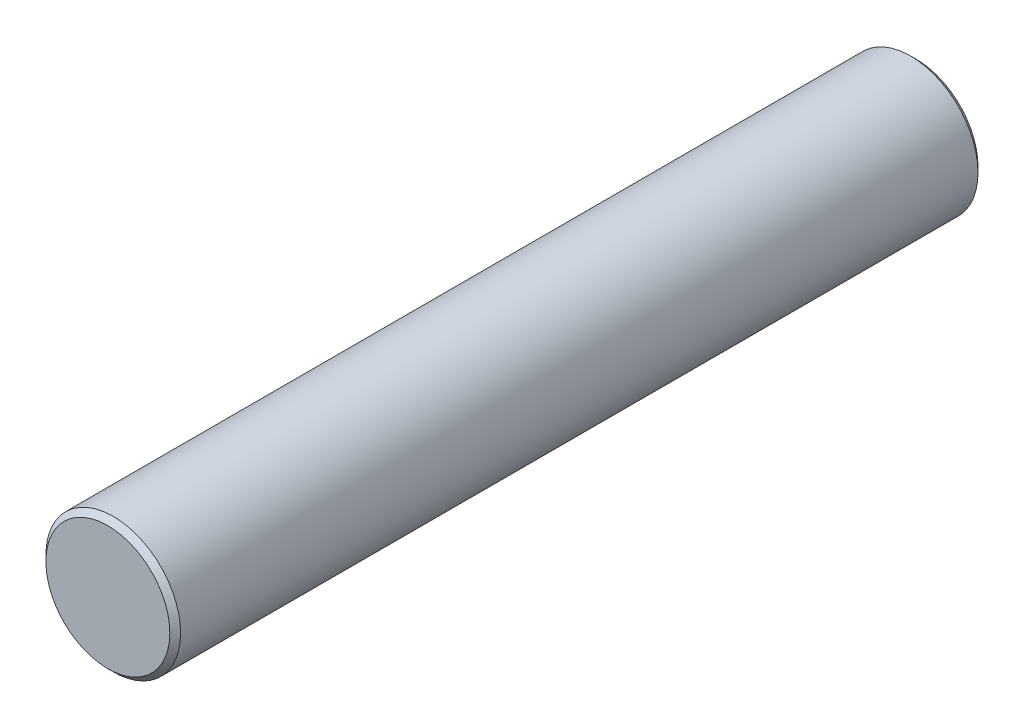
ISO-10303-21;
HEADER;
FILE_DESCRIPTION(('STEP AP214'),'2;1');
FILE_NAME('part.step','',(''),(''),'','','');
FILE_SCHEMA(('AUTOMOTIVE_DESIGN { 1 0 10303 214 1 1 1 1 }'));
ENDSEC;
DATA;
#1=APPLICATION_CONTEXT('core data for automotive mechanical design processes');
#2=APPLICATION_PROTOCOL_DEFINITION('international standard','automotive_design',2000,#1);
#3=PRODUCT_CONTEXT('',#1,'mechanical');
#4=PRODUCT('Part','Part','',(#3));
#5=PRODUCT_RELATED_PRODUCT_CATEGORY('part','',(#4));
#6=PRODUCT_DEFINITION_FORMATION('','',#4);
#7=PRODUCT_DEFINITION_CONTEXT('part definition',#1,'design');
#8=PRODUCT_DEFINITION('design','',#6,#7);
#9=PRODUCT_DEFINITION_SHAPE('','',#8);
#10=(LENGTH_UNIT() NAMED_UNIT(*) SI_UNIT(.MILLI.,.METRE.));
#11=(NAMED_UNIT(*) PLANE_ANGLE_UNIT() SI_UNIT($,.RADIAN.));
#12=(NAMED_UNIT(*) SI_UNIT($,.STERADIAN.) SOLID_ANGLE_UNIT());
#13=UNCERTAINTY_MEASURE_WITH_UNIT(LENGTH_MEASURE(1.E-05),#10,'distance_accuracy_value','');
#14=(GEOMETRIC_REPRESENTATION_CONTEXT(3) GLOBAL_UNCERTAINTY_ASSIGNED_CONTEXT((#13)) GLOBAL_UNIT_ASSIGNED_CONTEXT((#10,
#11,#12)) REPRESENTATION_CONTEXT('',''));
#15=CARTESIAN_POINT('',(0.,0.,0.));
#16=DIRECTION('',(0.,0.,1.));
#17=DIRECTION('',(1.,0.,0.));
#18=AXIS2_PLACEMENT_3D('',#15,#16,#17);
#19=CARTESIAN_POINT('',(0.,0.,-30.));
#20=DIRECTION('',(0.,0.,1.));
#21=DIRECTION('',(1.,0.,0.));
#22=AXIS2_PLACEMENT_3D('',#19,#20,#21);
#23=CYLINDRICAL_SURFACE('',#22,2.5);
#24=CARTESIAN_POINT('',(0.,0.,-29.8));
#25=DIRECTION('',(0.,0.,1.));
#26=DIRECTION('',(1.,0.,0.));
#27=AXIS2_PLACEMENT_3D('',#24,#25,#26);
#28=CIRCLE('',#27,2.5);
#29=CARTESIAN_POINT('',(2.5,0.,-29.8));
#30=VERTEX_POINT('',#29);
#31=EDGE_CURVE('E48',#30,#30,#28,.T.);
#32=ORIENTED_EDGE('',*,*,#31,.T.);
#33=EDGE_LOOP('',(#32));
#34=FACE_BOUND('',#33,.T.);
#35=CARTESIAN_POINT('',(0.,0.,-0.199999999999999));
#36=DIRECTION('',(0.,0.,1.));
#37=DIRECTION('',(1.,0.,0.));
#38=AXIS2_PLACEMENT_3D('',#35,#36,#37);
#39=CIRCLE('',#38,2.5);
#40=CARTESIAN_POINT('',(2.5,0.,-0.199999999999999));
#41=VERTEX_POINT('',#40);
#42=EDGE_CURVE('E52',#41,#41,#39,.F.);
#43=ORIENTED_EDGE('',*,*,#42,.T.);
#44=EDGE_LOOP('',(#43));
#45=FACE_BOUND('',#44,.T.);
#46=ADVANCED_FACE('F36',(#34,#45),#23,.T.);
#47=CARTESIAN_POINT('',(0.,0.,-30.));
#48=DIRECTION('',(0.,0.,1.));
#49=DIRECTION('',(1.,0.,0.));
#50=AXIS2_PLACEMENT_3D('',#47,#48,#49);
#51=PLANE('',#50);
#52=CARTESIAN_POINT('',(0.,0.,-30.));
#53=DIRECTION('',(0.,0.,1.));
#54=DIRECTION('',(1.,0.,0.));
#55=AXIS2_PLACEMENT_3D('',#52,#53,#54);
#56=CIRCLE('',#55,2.30000000000001);
#57=CARTESIAN_POINT('',(2.30000000000001,0.,-30.));
#58=VERTEX_POINT('',#57);
#59=EDGE_CURVE('E44',#58,#58,#56,.F.);
#60=ORIENTED_EDGE('',*,*,#59,.T.);
#61=EDGE_LOOP('',(#60));
#62=FACE_BOUND('',#61,.T.);
#63=ADVANCED_FACE('F68',(#62),#51,.F.);
#64=CARTESIAN_POINT('',(0.,0.,0.));
#65=DIRECTION('',(0.,0.,1.));
#66=DIRECTION('',(1.,0.,0.));
#67=AXIS2_PLACEMENT_3D('',#64,#65,#66);
#68=PLANE('',#67);
#69=CARTESIAN_POINT('',(0.,0.,0.));
#70=DIRECTION('',(0.,0.,1.));
#71=DIRECTION('',(1.,0.,0.));
#72=AXIS2_PLACEMENT_3D('',#69,#70,#71);
#73=CIRCLE('',#72,2.3);
#74=CARTESIAN_POINT('',(2.3,0.,0.));
#75=VERTEX_POINT('',#74);
#76=EDGE_CURVE('E10',#75,#75,#73,.T.);
#77=ORIENTED_EDGE('',*,*,#76,.T.);
#78=EDGE_LOOP('',(#77));
#79=FACE_BOUND('',#78,.T.);
#80=ADVANCED_FACE('F65',(#79),#68,.T.);
#81=CARTESIAN_POINT('',(0.,0.,-29.8));
#82=DIRECTION('',(0.,0.,1.));
#83=DIRECTION('',(1.,0.,0.));
#84=AXIS2_PLACEMENT_3D('',#81,#82,#83);
#85=CONICAL_SURFACE('',#84,2.5,0.785398163397435);
#86=ORIENTED_EDGE('',*,*,#59,.F.);
#87=EDGE_LOOP('',(#86));
#88=FACE_BOUND('',#87,.T.);
#89=ORIENTED_EDGE('',*,*,#31,.F.);
#90=EDGE_LOOP('',(#89));
#91=FACE_BOUND('',#90,.T.);
#92=ADVANCED_FACE('F61',(#88,#91),#85,.T.);
#93=CARTESIAN_POINT('',(0.,0.,0.));
#94=DIRECTION('',(0.,0.,-1.));
#95=DIRECTION('',(-1.,0.,0.));
#96=AXIS2_PLACEMENT_3D('',#93,#94,#95);
#97=CONICAL_SURFACE('',#96,2.3,0.785398163397453);
#98=ORIENTED_EDGE('',*,*,#42,.F.);
#99=EDGE_LOOP('',(#98));
#100=FACE_BOUND('',#99,.T.);
#101=ORIENTED_EDGE('',*,*,#76,.F.);
#102=EDGE_LOOP('',(#101));
#103=FACE_BOUND('',#102,.T.);
#104=ADVANCED_FACE('F39',(#100,#103),#97,.T.);
#105=CLOSED_SHELL('',(#46,#63,#80,#92,#104));
#106=MANIFOLD_SOLID_BREP('B2',#105);
#107=ADVANCED_BREP_SHAPE_REPRESENTATION('',(#18,#106),#14);
#108=SHAPE_DEFINITION_REPRESENTATION(#9,#107);
ENDSEC;
END-ISO-10303-21;
